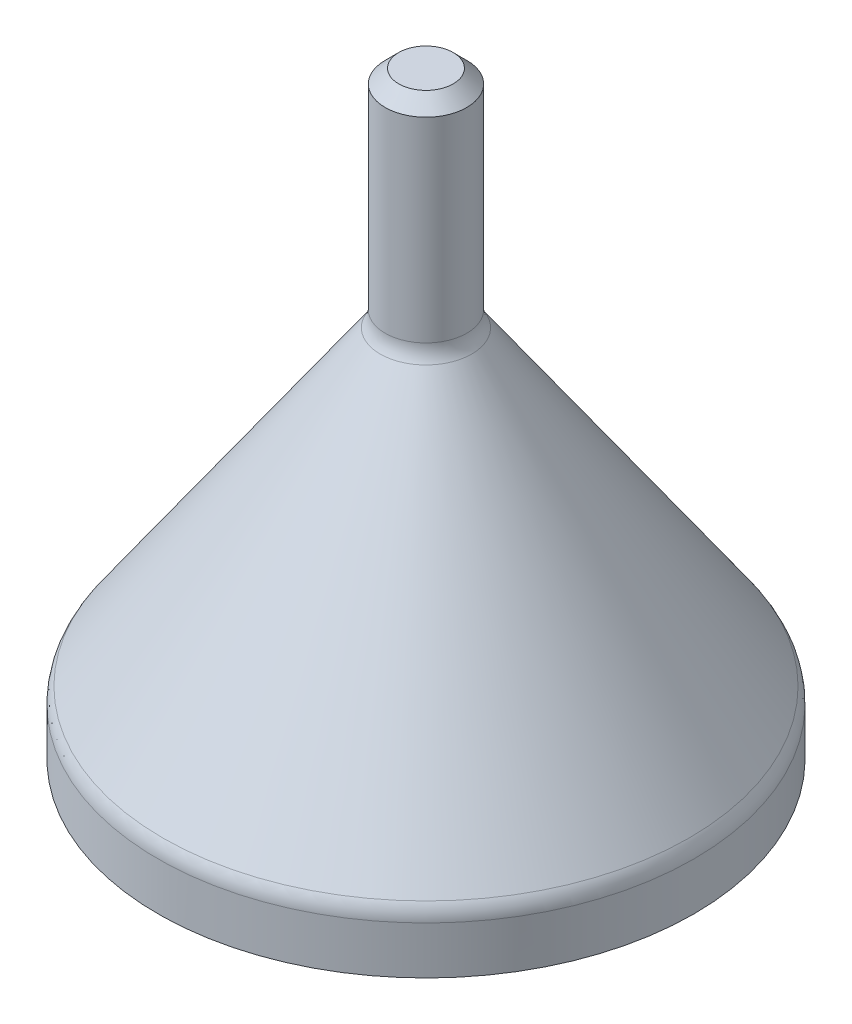
ISO-10303-21;
HEADER;
FILE_DESCRIPTION(('STEP AP214'),'2;1');
FILE_NAME('part.step','',(''),(''),'','','');
FILE_SCHEMA(('AUTOMOTIVE_DESIGN { 1 0 10303 214 1 1 1 1 }'));
ENDSEC;
DATA;
#1=APPLICATION_CONTEXT('core data for automotive mechanical design processes');
#2=APPLICATION_PROTOCOL_DEFINITION('international standard','automotive_design',2000,#1);
#3=PRODUCT_CONTEXT('',#1,'mechanical');
#4=PRODUCT('Part','Part','',(#3));
#5=PRODUCT_RELATED_PRODUCT_CATEGORY('part','',(#4));
#6=PRODUCT_DEFINITION_FORMATION('','',#4);
#7=PRODUCT_DEFINITION_CONTEXT('part definition',#1,'design');
#8=PRODUCT_DEFINITION('design','',#6,#7);
#9=PRODUCT_DEFINITION_SHAPE('','',#8);
#10=(LENGTH_UNIT() NAMED_UNIT(*) SI_UNIT(.MILLI.,.METRE.));
#11=(NAMED_UNIT(*) PLANE_ANGLE_UNIT() SI_UNIT($,.RADIAN.));
#12=(NAMED_UNIT(*) SI_UNIT($,.STERADIAN.) SOLID_ANGLE_UNIT());
#13=UNCERTAINTY_MEASURE_WITH_UNIT(LENGTH_MEASURE(1.E-05),#10,'distance_accuracy_value','');
#14=(GEOMETRIC_REPRESENTATION_CONTEXT(3) GLOBAL_UNCERTAINTY_ASSIGNED_CONTEXT((#13)) GLOBAL_UNIT_ASSIGNED_CONTEXT((#10,
#11,#12)) REPRESENTATION_CONTEXT('',''));
#15=CARTESIAN_POINT('',(0.,0.,0.));
#16=DIRECTION('',(0.,0.,1.));
#17=DIRECTION('',(1.,0.,0.));
#18=AXIS2_PLACEMENT_3D('',#15,#16,#17);
#19=CARTESIAN_POINT('',(0.,28.7782197193354,0.));
#20=DIRECTION('',(0.,-1.,0.));
#21=DIRECTION('',(1.,0.,0.));
#22=AXIS2_PLACEMENT_3D('',#19,#20,#21);
#23=CONICAL_SURFACE('',#22,0.,0.610865238198017);
#24=CARTESIAN_POINT('',(-12.5926114049583,10.7545224441937,-0.835936593249498));
#25=CARTESIAN_POINT('',(-12.5508956026552,10.8066246913389,-0.913561611274844));
#26=CARTESIAN_POINT('',(-12.5045538881382,10.8648521183377,-0.984613476689198));
#27=CARTESIAN_POINT('',(-12.4055523615441,10.9903638008953,-1.11298070252791));
#28=CARTESIAN_POINT('',(-12.3528814076504,11.0576640541483,-1.17027129037267));
#29=CARTESIAN_POINT('',(-12.2439356623663,11.1983240391587,-1.27071682922573));
#30=CARTESIAN_POINT('',(-12.1876919591053,11.2716327760279,-1.31397787493768));
#31=CARTESIAN_POINT('',(-12.0729697594106,11.4229124379558,-1.38709372737568));
#32=CARTESIAN_POINT('',(-12.0144920372611,11.50088175291,-1.41695313402002));
#33=CARTESIAN_POINT('',(-11.8859396960309,11.6745187058214,-1.4675331635222));
#34=CARTESIAN_POINT('',(-11.8156856151646,11.7708312197498,-1.48561356293596));
#35=CARTESIAN_POINT('',(-11.6758802099545,11.9657998903546,-1.50280354998056));
#36=CARTESIAN_POINT('',(-11.606329808705,12.0644586687203,-1.50189081403729));
#37=CARTESIAN_POINT('',(-11.4662190906323,12.2669622325049,-1.47975125590041));
#38=CARTESIAN_POINT('',(-11.3958101406985,12.3707967621472,-1.45742056492131));
#39=CARTESIAN_POINT('',(-11.2605663137459,12.5744895083554,-1.38975944551809));
#40=CARTESIAN_POINT('',(-11.1957215590801,12.674354594899,-1.34447080327255));
#41=CARTESIAN_POINT('',(-11.0907764768846,12.8394220356224,-1.24577625024087));
#42=CARTESIAN_POINT('',(-11.0487269293238,12.9066945535875,-1.19787807614214));
#43=CARTESIAN_POINT('',(-10.9702019014994,13.0342081443155,-1.08967448742342));
#44=CARTESIAN_POINT('',(-10.9337235041223,13.0944528929628,-1.02937560502852));
#45=CARTESIAN_POINT('',(-10.8673152359263,13.2056033588021,-0.896693332639933));
#46=CARTESIAN_POINT('',(-10.8374319710269,13.2564422236452,-0.824229934277203));
#47=CARTESIAN_POINT('',(-10.7857094163157,13.3453784863523,-0.669265636689653));
#48=CARTESIAN_POINT('',(-10.7638647543895,13.3834843919481,-0.586771490137676));
#49=CARTESIAN_POINT('',(-10.7312733052492,13.4407219942267,-0.425147956738924));
#50=CARTESIAN_POINT('',(-10.7194945163416,13.4616067390038,-0.346845248863057));
#51=CARTESIAN_POINT('',(-10.703248046651,13.4904814795136,-0.187172694659556));
#52=CARTESIAN_POINT('',(-10.6987760177962,13.4984791439893,-0.105804701923974));
#53=CARTESIAN_POINT('',(-10.6973554283625,13.5010168703904,0.0504147217069086));
#54=CARTESIAN_POINT('',(-10.6998130286008,13.4966191736057,0.125246277786922));
#55=CARTESIAN_POINT('',(-10.7109206781358,13.4768356792963,0.272957487391654));
#56=CARTESIAN_POINT('',(-10.7195697514825,13.4614516135325,0.345837446664768));
#57=CARTESIAN_POINT('',(-10.7427071992224,13.4206070141369,0.487072132558397));
#58=CARTESIAN_POINT('',(-10.7571483680597,13.3952279690842,0.555458361652506));
#59=CARTESIAN_POINT('',(-10.7914592821343,13.335520774105,0.686721698883544));
#60=CARTESIAN_POINT('',(-10.8113299486798,13.301191105431,0.749597869648752));
#61=CARTESIAN_POINT('',(-10.8572654768215,13.2227465461481,0.872054164587742));
#62=CARTESIAN_POINT('',(-10.8836212434015,13.1781818564972,0.931235705749465));
#63=CARTESIAN_POINT('',(-10.9411153531182,13.0822764064069,1.04115584944306));
#64=CARTESIAN_POINT('',(-10.9722554913462,13.0309331036604,1.09189126805001));
#65=CARTESIAN_POINT('',(-11.042364457927,12.9169670140834,1.18972007684476));
#66=CARTESIAN_POINT('',(-11.0818209744811,12.8537255746532,1.23574068779784));
#67=CARTESIAN_POINT('',(-11.1647594071077,12.7228917581338,1.3165676391019));
#68=CARTESIAN_POINT('',(-11.2082434704821,12.6552970660105,1.35136795248789));
#69=CARTESIAN_POINT('',(-11.3052506805847,12.5068223889713,1.41442505903487));
#70=CARTESIAN_POINT('',(-11.3592883076128,12.4255001520707,1.44084743495057));
#71=CARTESIAN_POINT('',(-11.4701714391519,12.2614259984783,1.47944920641372));
#72=CARTESIAN_POINT('',(-11.5270183816219,12.1786733640216,1.49162122749266));
#73=CARTESIAN_POINT('',(-11.6513410848862,12.0004955280357,1.50305160357387));
#74=CARTESIAN_POINT('',(-11.7190905285343,11.9051090967645,1.49999689327258));
#75=CARTESIAN_POINT('',(-11.8550215685947,11.7167847191676,1.47608034621491));
#76=CARTESIAN_POINT('',(-11.9232035702637,11.6238496943201,1.45519817163664));
#77=CARTESIAN_POINT('',(-12.0639863940158,11.434643526264,1.39324623362651));
#78=CARTESIAN_POINT('',(-12.1364527131596,11.3387905113602,1.35057184932841));
#79=CARTESIAN_POINT('',(-12.2767146378794,11.1556408810547,1.24428137219593));
#80=CARTESIAN_POINT('',(-12.3445169044964,11.0683319845564,1.18069592759113));
#81=CARTESIAN_POINT('',(-12.4526872386755,10.9304627153877,1.05453181211758));
#82=CARTESIAN_POINT('',(-12.4952144327866,10.8766989515809,0.997285964523039));
#83=CARTESIAN_POINT('',(-12.5743136266482,10.7772955533815,0.872542443731813));
#84=CARTESIAN_POINT('',(-12.6108947168745,10.7316435075502,0.805060730520137));
#85=CARTESIAN_POINT('',(-12.6703254184212,10.6578066574453,0.673194051513325));
#86=CARTESIAN_POINT('',(-12.6944570973184,10.6279642092017,0.610319914686144));
#87=CARTESIAN_POINT('',(-12.7359266290139,10.5768154453456,0.479057536097707));
#88=CARTESIAN_POINT('',(-12.7532678709476,10.5555048713195,0.410672065670199));
#89=CARTESIAN_POINT('',(-12.7800457291806,10.5226435665399,0.269609921976896));
#90=CARTESIAN_POINT('',(-12.7894339622827,10.5111525708588,0.196909821829435));
#91=CARTESIAN_POINT('',(-12.7993414619633,10.4990268034942,0.0500165519241918));
#92=CARTESIAN_POINT('',(-12.7998648062791,10.4983870403801,-0.0241759156383689));
#93=CARTESIAN_POINT('',(-12.7924213313269,10.5074960134544,-0.163757844371654));
#94=CARTESIAN_POINT('',(-12.785321863471,10.5161834587704,-0.22926812872854));
#95=CARTESIAN_POINT('',(-12.7644569816947,10.5417675667315,-0.357543452661431));
#96=CARTESIAN_POINT('',(-12.7506910752541,10.5586648359231,-0.420308289028612));
#97=CARTESIAN_POINT('',(-12.7162779823394,10.6010314129583,-0.545450632226986));
#98=CARTESIAN_POINT('',(-12.6952600784131,10.6269634718351,-0.607567574236428));
#99=CARTESIAN_POINT('',(-12.6477632584975,10.6858029433922,-0.726139919725178));
#100=CARTESIAN_POINT('',(-12.621279702296,10.7187162836825,-0.782590451626292));
#101=CARTESIAN_POINT('',(-12.5926114049583,10.7545224441937,-0.835936593249498));
#102=B_SPLINE_CURVE_WITH_KNOTS('',3,(#24,#25,#26,#27,#28,#29,#30,#31,#32,#33,#34,#35,#36,#37,
#38,#39,#40,#41,#42,#43,#44,#45,#46,#47,#48,#49,#50,#51,#52,#53,#54,#55,#56,#57,#58,#59,#60,#61,
#62,#63,#64,#65,#66,#67,#68,#69,#70,#71,#72,#73,#74,#75,#76,#77,#78,#79,#80,#81,#82,#83,#84,#85,
#86,#87,#88,#89,#90,#91,#92,#93,#94,#95,#96,#97,#98,#99,#100,#101),.UNSPECIFIED.,.T.,.F.,(4,2,2,
2,2,2,2,2,2,2,2,2,2,2,2,2,2,2,2,2,2,2,2,2,2,2,2,2,2,2,2,2,2,2,2,2,2,2,4),(0.,0.306813519229993,
0.614175282427592,0.91915535078691,1.22403065895648,1.58420875469197,1.94481020949508,
2.32505484887022,2.70460986988088,2.98151580564581,3.25827624972269,3.53693394996558,
3.81540508652097,4.05974806982483,4.3039455976484,4.52786755983203,4.75175423340075,
4.97385215047346,5.19598777781616,5.43092100289255,5.66594259090585,5.92772928679322,
6.1896563676209,6.4919413204163,6.79438263471473,7.1440466882637,7.49411017734753,
7.87476370165074,8.25486179036361,8.52183292863851,8.78839199926221,9.00848376263892,
9.22846553685432,9.44977618051768,9.67098502130495,9.8694511333961,10.0679319105099,
10.2786033755714,10.4894544370605),.UNSPECIFIED.);
#103=CARTESIAN_POINT('',(-12.5926114049583,10.7545224441937,-0.835936593249498));
#104=VERTEX_POINT('',#103);
#105=EDGE_CURVE('E190',#104,#104,#102,.T.);
#106=ORIENTED_EDGE('',*,*,#105,.F.);
#107=EDGE_LOOP('',(#106));
#108=FACE_BOUND('',#107,.T.);
#109=CARTESIAN_POINT('',(11.7132659625169,11.9137831722595,-1.49752016968533));
#110=CARTESIAN_POINT('',(11.7870811637891,11.8102962773236,-1.49156241075206));
#111=CARTESIAN_POINT('',(11.8615439415129,11.7078005300675,-1.47491254463486));
#112=CARTESIAN_POINT('',(12.0094563153704,11.5074312516468,-1.42062521342872));
#113=CARTESIAN_POINT('',(12.0829035863991,11.4095673783164,-1.38294582552693));
#114=CARTESIAN_POINT('',(12.2254170982042,11.2222294131524,-1.28688945090419));
#115=CARTESIAN_POINT('',(12.294510691411,11.1327007928822,-1.22866099603874));
#116=CARTESIAN_POINT('',(12.4252382284491,10.965155041504,-1.09122002317221));
#117=CARTESIAN_POINT('',(12.4868960288124,10.8871009097382,-1.01207736264008));
#118=CARTESIAN_POINT('',(12.5774310921033,10.7734168107309,-0.866372856612213));
#119=CARTESIAN_POINT('',(12.6099985097464,10.7327727572208,-0.805982470788031));
#120=CARTESIAN_POINT('',(12.6687786752162,10.6597145584473,-0.677553042576472));
#121=CARTESIAN_POINT('',(12.6949958294602,10.627294705707,-0.609519352103331));
#122=CARTESIAN_POINT('',(12.7396195607387,10.5722661559582,-0.466371437905145));
#123=CARTESIAN_POINT('',(12.7579551750226,10.5497465579881,-0.391200032240727));
#124=CARTESIAN_POINT('',(12.7849152588813,10.5166768360648,-0.236596386339301));
#125=CARTESIAN_POINT('',(12.7935498689991,10.5061142132951,-0.157168686436146));
#126=CARTESIAN_POINT('',(12.7998261157345,10.4984352613772,-0.00834814988183296));
#127=CARTESIAN_POINT('',(12.7988269111336,10.4996564672231,0.0609077582648478));
#128=CARTESIAN_POINT('',(12.7891172059464,10.5115403380602,0.198042939894432));
#129=CARTESIAN_POINT('',(12.7804075026347,10.5222020268945,0.265922354966043));
#130=CARTESIAN_POINT('',(12.7564362979742,10.5516146433761,0.395484485610808));
#131=CARTESIAN_POINT('',(12.7414728283408,10.5699977733809,0.457308160016786));
#132=CARTESIAN_POINT('',(12.7059180858014,10.6138140718584,0.576657157758586));
#133=CARTESIAN_POINT('',(12.6853258011459,10.6392485077774,0.634181705980079));
#134=CARTESIAN_POINT('',(12.6368971501649,10.6992995694738,0.750275396565759));
#135=CARTESIAN_POINT('',(12.608508955691,10.7346239629456,0.808245311569967));
#136=CARTESIAN_POINT('',(12.5471833009159,10.8113375352528,0.917354597627972));
#137=CARTESIAN_POINT('',(12.514241861687,10.8527320204858,0.968487916674434));
#138=CARTESIAN_POINT('',(12.4285034609652,10.9611336208239,1.08620138487265));
#139=CARTESIAN_POINT('',(12.3736734806929,11.0310079135855,1.14868086305455));
#140=CARTESIAN_POINT('',(12.2592467028571,11.1784191067084,1.25836057082329));
#141=CARTESIAN_POINT('',(12.1996430661411,11.2559670398253,1.30553837135752));
#142=CARTESIAN_POINT('',(12.077063566428,11.4174314231766,1.3852104729235));
#143=CARTESIAN_POINT('',(12.0140561708662,11.5014123153773,1.41752462191964));
#144=CARTESIAN_POINT('',(11.8870646865899,11.6730620552952,1.466657660209));
#145=CARTESIAN_POINT('',(11.8230804470581,11.7607314762386,1.48347413167169));
#146=CARTESIAN_POINT('',(11.6861580058429,11.9512664575483,1.50269899508566));
#147=CARTESIAN_POINT('',(11.6133012655485,12.054455198188,1.50259669845844));
#148=CARTESIAN_POINT('',(11.4705472245248,12.2606382181704,1.48081010511892));
#149=CARTESIAN_POINT('',(11.4006484599019,12.3636325690219,1.45913661728708));
#150=CARTESIAN_POINT('',(11.2786222625164,12.5472035689045,1.39931787202593));
#151=CARTESIAN_POINT('',(11.2255945607116,12.6284119431864,1.36494689383895));
#152=CARTESIAN_POINT('',(11.1245403205457,12.7858646385214,1.28077073258223));
#153=CARTESIAN_POINT('',(11.0765118658787,12.8621108574311,1.23097149277991));
#154=CARTESIAN_POINT('',(10.9866709269226,13.0071409474346,1.11549355100603));
#155=CARTESIAN_POINT('',(10.9449124585044,13.0758587300182,1.04968838289859));
#156=CARTESIAN_POINT('',(10.8698208892291,13.2012979141711,0.903400883998193));
#157=CARTESIAN_POINT('',(10.8364792533581,13.2580314586408,0.822933564998782));
#158=CARTESIAN_POINT('',(10.7839704123611,13.3484166965518,0.662542373972642));
#159=CARTESIAN_POINT('',(10.7634382287072,13.3842381257493,0.584287082287457));
#160=CARTESIAN_POINT('',(10.7304224587858,13.4422116716986,0.421288166773555));
#161=CARTESIAN_POINT('',(10.7179313623975,13.464376542411,0.336550680128121));
#162=CARTESIAN_POINT('',(10.7025034663088,13.4918140507982,0.174379881602239));
#163=CARTESIAN_POINT('',(10.6985805149822,13.4988290142017,0.0973300471512026));
#164=CARTESIAN_POINT('',(10.6974207681067,13.5008994733137,-0.0569690945058429));
#165=CARTESIAN_POINT('',(10.7001815573893,13.4959592890131,-0.134218319585487));
#166=CARTESIAN_POINT('',(10.7120284854295,13.4748663661891,-0.283161436972278));
#167=CARTESIAN_POINT('',(10.7208313289082,13.4592158970343,-0.354950278233228));
#168=CARTESIAN_POINT('',(10.744202080129,13.4179776741545,-0.494612641163449));
#169=CARTESIAN_POINT('',(10.7587701757748,13.3923895965394,-0.562486035136184));
#170=CARTESIAN_POINT('',(10.7937387585931,13.331572253393,-0.694508696922351));
#171=CARTESIAN_POINT('',(10.8142879411962,13.2960983161571,-0.758505225636307));
#172=CARTESIAN_POINT('',(10.860478563144,13.2173080445247,-0.87941677162039));
#173=CARTESIAN_POINT('',(10.8861213652969,13.1739896115923,-0.93632988706614));
#174=CARTESIAN_POINT('',(10.9443207559582,13.0769545647246,-1.04692217229046));
#175=CARTESIAN_POINT('',(10.9772874117477,13.0226581009078,-1.0998747376024));
#176=CARTESIAN_POINT('',(11.0476428896149,12.9085031337516,-1.19590754623009));
#177=CARTESIAN_POINT('',(11.0850341670447,12.848641546149,-1.23898226872354));
#178=CARTESIAN_POINT('',(11.168809417327,12.7165207257995,-1.32038622916697));
#179=CARTESIAN_POINT('',(11.2157223437028,12.6436904945171,-1.35724078999774));
#180=CARTESIAN_POINT('',(11.3130208064513,12.4951307296155,-1.41820263799831));
#181=CARTESIAN_POINT('',(11.3634068521782,12.4194007714606,-1.44230805091241));
#182=CARTESIAN_POINT('',(11.4631231395631,12.2718602366534,-1.47697030163077));
#183=CARTESIAN_POINT('',(11.5122962498151,12.2001288600889,-1.48832973135795));
#184=CARTESIAN_POINT('',(11.6119657404553,12.0567028702671,-1.50065629469935));
#185=CARTESIAN_POINT('',(11.6624624758156,11.9850082722393,-1.50162061134937));
#186=CARTESIAN_POINT('',(11.7132659625169,11.9137831722595,-1.49752016968533));
#187=B_SPLINE_CURVE_WITH_KNOTS('',3,(#109,#110,#111,#112,#113,#114,#115,#116,#117,#118,#119,
#120,#121,#122,#123,#124,#125,#126,#127,#128,#129,#130,#131,#132,#133,#134,#135,#136,#137,#138,
#139,#140,#141,#142,#143,#144,#145,#146,#147,#148,#149,#150,#151,#152,#153,#154,#155,#156,#157,
#158,#159,#160,#161,#162,#163,#164,#165,#166,#167,#168,#169,#170,#171,#172,#173,#174,#175,#176,
#177,#178,#179,#180,#181,#182,#183,#184,#185,#186),.UNSPECIFIED.,.T.,.F.,(4,2,2,2,2,2,2,2,2,2,2,
2,2,2,2,2,2,2,2,2,2,2,2,2,2,2,2,2,2,2,2,2,2,2,2,2,2,2,4),(0.,0.381450889691871,
0.763664940332903,1.14317104102086,1.52142519866165,1.75979335681162,1.99799563553228,
2.23829983625996,2.47835261055227,2.68509489462516,2.89181580380151,3.08964204664326,
3.28750387110516,3.50743635514111,3.72756226037539,4.05158685133837,4.37608427025312,
4.70441728455703,5.03280151422888,5.40995499487538,5.786919586763,6.09437324043503,
6.40170860391781,6.71155601879107,7.02108796200031,7.28498968490526,7.54864457298773,
7.77987190585097,8.01101569722884,8.23200200623793,8.45299551831966,8.68003657299444,
8.90713845497992,9.15424726695354,9.40149385564534,9.68285282161324,9.96425313875016,
10.2267164919841,10.4892509681855),.UNSPECIFIED.);
#188=CARTESIAN_POINT('',(11.7132659625169,11.9137831722595,-1.49752016968533));
#189=VERTEX_POINT('',#188);
#190=EDGE_CURVE('E183',#189,#189,#187,.T.);
#191=ORIENTED_EDGE('',*,*,#190,.F.);
#192=EDGE_LOOP('',(#191));
#193=FACE_BOUND('',#192,.T.);
#194=CARTESIAN_POINT('',(0.,3.5,0.));
#195=DIRECTION('',(0.,-1.,0.));
#196=DIRECTION('',(1.,0.,0.));
#197=AXIS2_PLACEMENT_3D('',#194,#195,#196);
#198=CIRCLE('',#197,17.7);
#199=CARTESIAN_POINT('',(17.7,3.5,0.));
#200=VERTEX_POINT('',#199);
#201=EDGE_CURVE('E168',#200,#200,#198,.T.);
#202=ORIENTED_EDGE('',*,*,#201,.T.);
#203=EDGE_LOOP('',(#202));
#204=FACE_BOUND('',#203,.T.);
#205=CARTESIAN_POINT('',(0.,28.7782197193354,0.));
#206=VERTEX_POINT('',#205);
#207=VERTEX_LOOP('',#206);
#208=FACE_BOUND('',#207,.T.);
#209=ADVANCED_FACE('F33',(#108,#193,#204,#208),#23,.F.);
#210=CARTESIAN_POINT('',(0.,0.,0.));
#211=DIRECTION('',(0.,-1.,0.));
#212=DIRECTION('',(1.,0.,0.));
#213=AXIS2_PLACEMENT_3D('',#210,#211,#212);
#214=CYLINDRICAL_SURFACE('',#213,17.7);
#215=DIRECTION('',(0.,-1.,0.));
#216=VECTOR('',#215,1.);
#217=CARTESIAN_POINT('',(3.2,3.,17.4083313387585));
#218=LINE('',#217,#216);
#219=CARTESIAN_POINT('',(3.2,3.,17.4083313387585));
#220=VERTEX_POINT('',#219);
#221=CARTESIAN_POINT('',(3.2,0.,17.4083313387585));
#222=VERTEX_POINT('',#221);
#223=EDGE_CURVE('E134',#220,#222,#218,.T.);
#224=ORIENTED_EDGE('',*,*,#223,.F.);
#225=CARTESIAN_POINT('',(0.,3.,0.));
#226=DIRECTION('',(0.,1.,0.));
#227=DIRECTION('',(1.,0.,0.));
#228=AXIS2_PLACEMENT_3D('',#225,#226,#227);
#229=CIRCLE('',#228,17.7);
#230=CARTESIAN_POINT('',(-3.2,3.,17.4083313387585));
#231=VERTEX_POINT('',#230);
#232=EDGE_CURVE('E116',#231,#220,#229,.T.);
#233=ORIENTED_EDGE('',*,*,#232,.F.);
#234=DIRECTION('',(0.,-1.,0.));
#235=VECTOR('',#234,1.);
#236=CARTESIAN_POINT('',(-3.2,3.,17.4083313387585));
#237=LINE('',#236,#235);
#238=CARTESIAN_POINT('',(-3.2,0.,17.4083313387585));
#239=VERTEX_POINT('',#238);
#240=EDGE_CURVE('E107',#231,#239,#237,.T.);
#241=ORIENTED_EDGE('',*,*,#240,.T.);
#242=CARTESIAN_POINT('',(0.,0.,0.));
#243=DIRECTION('',(0.,-1.,0.));
#244=DIRECTION('',(1.,0.,0.));
#245=AXIS2_PLACEMENT_3D('',#242,#243,#244);
#246=CIRCLE('',#245,17.7);
#247=CARTESIAN_POINT('',(-3.2,0.,-17.4083313387585));
#248=VERTEX_POINT('',#247);
#249=EDGE_CURVE('E167',#239,#248,#246,.T.);
#250=ORIENTED_EDGE('',*,*,#249,.T.);
#251=DIRECTION('',(0.,-1.,0.));
#252=VECTOR('',#251,1.);
#253=CARTESIAN_POINT('',(-3.2,3.,-17.4083313387585));
#254=LINE('',#253,#252);
#255=CARTESIAN_POINT('',(-3.2,3.,-17.4083313387585));
#256=VERTEX_POINT('',#255);
#257=EDGE_CURVE('E156',#256,#248,#254,.T.);
#258=ORIENTED_EDGE('',*,*,#257,.F.);
#259=CARTESIAN_POINT('',(0.,3.,0.));
#260=DIRECTION('',(0.,1.,0.));
#261=DIRECTION('',(1.,0.,0.));
#262=AXIS2_PLACEMENT_3D('',#259,#260,#261);
#263=CIRCLE('',#262,17.7);
#264=CARTESIAN_POINT('',(3.19999999999999,3.,-17.4083313387585));
#265=VERTEX_POINT('',#264);
#266=EDGE_CURVE('E144',#265,#256,#263,.T.);
#267=ORIENTED_EDGE('',*,*,#266,.F.);
#268=DIRECTION('',(0.,-1.,0.));
#269=VECTOR('',#268,1.);
#270=CARTESIAN_POINT('',(3.19999999999999,3.,-17.4083313387585));
#271=LINE('',#270,#269);
#272=CARTESIAN_POINT('',(3.19999999999999,0.,-17.4083313387585));
#273=VERTEX_POINT('',#272);
#274=EDGE_CURVE('E158',#265,#273,#271,.T.);
#275=ORIENTED_EDGE('',*,*,#274,.T.);
#276=EDGE_CURVE('E164',#273,#222,#246,.T.);
#277=ORIENTED_EDGE('',*,*,#276,.T.);
#278=EDGE_LOOP('',(#224,#233,#241,#250,#258,#267,#275,#277));
#279=FACE_BOUND('',#278,.T.);
#280=ORIENTED_EDGE('',*,*,#201,.F.);
#281=EDGE_LOOP('',(#280));
#282=FACE_BOUND('',#281,.T.);
#283=ADVANCED_FACE('F225',(#279,#282),#214,.F.);
#284=CARTESIAN_POINT('',(17.7,0.,0.));
#285=DIRECTION('',(0.,-1.,0.));
#286=DIRECTION('',(1.,0.,0.));
#287=AXIS2_PLACEMENT_3D('',#284,#285,#286);
#288=PLANE('',#287);
#289=DIRECTION('',(0.,0.,1.));
#290=VECTOR('',#289,1.);
#291=CARTESIAN_POINT('',(3.2,0.,18.6271307506014));
#292=LINE('',#291,#290);
#293=CARTESIAN_POINT('',(3.2,0.,18.6271307506014));
#294=VERTEX_POINT('',#293);
#295=EDGE_CURVE('E120',#222,#294,#292,.T.);
#296=ORIENTED_EDGE('',*,*,#295,.F.);
#297=ORIENTED_EDGE('',*,*,#276,.F.);
#298=DIRECTION('',(0.,0.,1.));
#299=VECTOR('',#298,1.);
#300=CARTESIAN_POINT('',(3.2,0.,-17.4083313387585));
#301=LINE('',#300,#299);
#302=CARTESIAN_POINT('',(3.2,0.,-18.6271307506014));
#303=VERTEX_POINT('',#302);
#304=EDGE_CURVE('E151',#303,#273,#301,.T.);
#305=ORIENTED_EDGE('',*,*,#304,.F.);
#306=CARTESIAN_POINT('',(0.,0.,0.));
#307=DIRECTION('',(0.,-1.,0.));
#308=DIRECTION('',(1.,0.,0.));
#309=AXIS2_PLACEMENT_3D('',#306,#307,#308);
#310=CIRCLE('',#309,18.9);
#311=CARTESIAN_POINT('',(-3.2,0.,-18.6271307506014));
#312=VERTEX_POINT('',#311);
#313=EDGE_CURVE('E56',#312,#303,#310,.T.);
#314=ORIENTED_EDGE('',*,*,#313,.F.);
#315=DIRECTION('',(0.,0.,-1.));
#316=VECTOR('',#315,1.);
#317=CARTESIAN_POINT('',(-3.2,0.,-17.4083313387585));
#318=LINE('',#317,#316);
#319=EDGE_CURVE('E141',#248,#312,#318,.T.);
#320=ORIENTED_EDGE('',*,*,#319,.F.);
#321=ORIENTED_EDGE('',*,*,#249,.F.);
#322=DIRECTION('',(0.,0.,-1.));
#323=VECTOR('',#322,1.);
#324=CARTESIAN_POINT('',(-3.2,0.,18.6271307506014));
#325=LINE('',#324,#323);
#326=CARTESIAN_POINT('',(-3.2,0.,18.6271307506014));
#327=VERTEX_POINT('',#326);
#328=EDGE_CURVE('E123',#327,#239,#325,.T.);
#329=ORIENTED_EDGE('',*,*,#328,.F.);
#330=CARTESIAN_POINT('',(0.,0.,0.));
#331=DIRECTION('',(0.,-1.,0.));
#332=DIRECTION('',(1.,0.,0.));
#333=AXIS2_PLACEMENT_3D('',#330,#331,#332);
#334=CIRCLE('',#333,18.9);
#335=EDGE_CURVE('E48',#294,#327,#334,.T.);
#336=ORIENTED_EDGE('',*,*,#335,.F.);
#337=EDGE_LOOP('',(#296,#297,#305,#314,#320,#321,#329,#336));
#338=FACE_BOUND('',#337,.T.);
#339=CARTESIAN_POINT('',(0.,0.,0.));
#340=DIRECTION('',(0.,-1.,0.));
#341=DIRECTION('',(1.,0.,0.));
#342=AXIS2_PLACEMENT_3D('',#339,#340,#341);
#343=CIRCLE('',#342,19.7);
#344=CARTESIAN_POINT('',(19.7,0.,0.));
#345=VERTEX_POINT('',#344);
#346=EDGE_CURVE('E133',#345,#345,#343,.T.);
#347=ORIENTED_EDGE('',*,*,#346,.T.);
#348=EDGE_LOOP('',(#347));
#349=FACE_BOUND('',#348,.T.);
#350=ADVANCED_FACE('F222',(#338,#349),#288,.T.);
#351=CARTESIAN_POINT('',(0.,0.,0.));
#352=DIRECTION('',(0.,-1.,0.));
#353=DIRECTION('',(1.,0.,0.));
#354=AXIS2_PLACEMENT_3D('',#351,#352,#353);
#355=CYLINDRICAL_SURFACE('',#354,19.7);
#356=CARTESIAN_POINT('',(0.,3.5,0.));
#357=DIRECTION('',(0.,1.,0.));
#358=DIRECTION('',(-1.,0.,0.));
#359=AXIS2_PLACEMENT_3D('',#356,#357,#358);
#360=CIRCLE('',#359,19.7);
#361=CARTESIAN_POINT('',(-19.7,3.5,0.));
#362=VERTEX_POINT('',#361);
#363=EDGE_CURVE('E180',#362,#362,#360,.F.);
#364=ORIENTED_EDGE('',*,*,#363,.T.);
#365=EDGE_LOOP('',(#364));
#366=FACE_BOUND('',#365,.T.);
#367=ORIENTED_EDGE('',*,*,#346,.F.);
#368=EDGE_LOOP('',(#367));
#369=FACE_BOUND('',#368,.T.);
#370=ADVANCED_FACE('F218',(#366,#369),#355,.T.);
#371=CARTESIAN_POINT('',(0.,4.13059757775796,0.));
#372=DIRECTION('',(0.,-1.,0.));
#373=DIRECTION('',(1.,0.,0.));
#374=AXIS2_PLACEMENT_3D('',#371,#372,#373);
#375=CONICAL_SURFACE('',#374,19.7,0.610865238198017);
#376=CARTESIAN_POINT('',(0.,27.4641139954071,0.));
#377=DIRECTION('',(0.,-1.,0.));
#378=DIRECTION('',(1.,0.,0.));
#379=AXIS2_PLACEMENT_3D('',#376,#377,#378);
#380=CIRCLE('',#379,3.36169591142201);
#381=CARTESIAN_POINT('',(3.36169591142201,27.4641139954071,0.));
#382=VERTEX_POINT('',#381);
#383=EDGE_CURVE('E174',#382,#382,#380,.T.);
#384=CARTESIAN_POINT('',(0.,4.6471528727021,0.));
#385=DIRECTION('',(0.,1.,0.));
#386=DIRECTION('',(-1.,0.,0.));
#387=AXIS2_PLACEMENT_3D('',#384,#385,#386);
#388=CIRCLE('',#387,19.338304088578);
#389=CARTESIAN_POINT('',(19.338304088578,4.64715287270209,0.));
#390=VERTEX_POINT('',#389);
#391=EDGE_CURVE('E171',#390,#390,#388,.T.);
#392=CARTESIAN_POINT('',(3.36169591142201,27.4641139954071,0.));
#393=CARTESIAN_POINT('',(3.52811891326738,27.2264373170456,0.));
#394=CARTESIAN_POINT('',(3.69454191511276,26.9887606386841,0.));
#395=CARTESIAN_POINT('',(4.02738791880351,26.5134072819611,0.));
#396=CARTESIAN_POINT('',(4.19381092064888,26.2757306035995,0.));
#397=CARTESIAN_POINT('',(4.52665692433963,25.8003772468765,0.));
#398=CARTESIAN_POINT('',(4.69307992618501,25.562700568515,0.));
#399=CARTESIAN_POINT('',(5.02592592987576,25.087347211792,0.));
#400=CARTESIAN_POINT('',(5.19234893172113,24.8496705334305,0.));
#401=CARTESIAN_POINT('',(5.52519493541188,24.3743171767075,0.));
#402=CARTESIAN_POINT('',(5.69161793725726,24.136640498346,0.));
#403=CARTESIAN_POINT('',(6.02446394094801,23.6612871416229,0.));
#404=CARTESIAN_POINT('',(6.19088694279338,23.4236104632614,0.));
#405=CARTESIAN_POINT('',(6.52373294648413,22.9482571065384,0.));
#406=CARTESIAN_POINT('',(6.6901559483295,22.7105804281769,0.));
#407=CARTESIAN_POINT('',(7.02300195202025,22.2352270714539,0.));
#408=CARTESIAN_POINT('',(7.18942495386563,21.9975503930924,0.));
#409=CARTESIAN_POINT('',(7.52227095755638,21.5221970363693,0.));
#410=CARTESIAN_POINT('',(7.68869395940175,21.2845203580078,0.));
#411=CARTESIAN_POINT('',(8.0215399630925,20.8091670012848,0.));
#412=CARTESIAN_POINT('',(8.18796296493788,20.5714903229233,0.));
#413=CARTESIAN_POINT('',(8.52080896862863,20.0961369662003,0.));
#414=CARTESIAN_POINT('',(8.687231970474,19.8584602878388,0.));
#415=CARTESIAN_POINT('',(9.02007797416475,19.3831069311157,0.));
#416=CARTESIAN_POINT('',(9.18650097601012,19.1454302527542,0.));
#417=CARTESIAN_POINT('',(9.51934697970088,18.6700768960312,0.));
#418=CARTESIAN_POINT('',(9.68576998154625,18.4324002176697,0.));
#419=CARTESIAN_POINT('',(10.018615985237,17.9570468609467,0.));
#420=CARTESIAN_POINT('',(10.1850389870824,17.7193701825852,0.));
#421=CARTESIAN_POINT('',(10.5178849907731,17.2440168258621,0.));
#422=CARTESIAN_POINT('',(10.6843079926185,17.0063401475006,0.));
#423=CARTESIAN_POINT('',(11.0171539963092,16.5309867907776,0.));
#424=CARTESIAN_POINT('',(11.1835769981546,16.2933101124161,0.));
#425=CARTESIAN_POINT('',(11.5164230018454,15.8179567556931,0.));
#426=CARTESIAN_POINT('',(11.6828460036907,15.5802800773316,0.));
#427=CARTESIAN_POINT('',(12.0156920073815,15.1049267206086,0.));
#428=CARTESIAN_POINT('',(12.1821150092269,14.867250042247,0.));
#429=CARTESIAN_POINT('',(12.5149610129176,14.391896685524,0.));
#430=CARTESIAN_POINT('',(12.681384014763,14.1542200071625,0.));
#431=CARTESIAN_POINT('',(13.0142300184537,13.6788666504395,0.));
#432=CARTESIAN_POINT('',(13.1806530202991,13.441189972078,0.));
#433=CARTESIAN_POINT('',(13.5134990239899,12.965836615355,0.));
#434=CARTESIAN_POINT('',(13.6799220258352,12.7281599369934,0.));
#435=CARTESIAN_POINT('',(14.012768029526,12.2528065802704,0.));
#436=CARTESIAN_POINT('',(14.1791910313714,12.0151299019089,0.));
#437=CARTESIAN_POINT('',(14.5120370350621,11.5397765451859,0.));
#438=CARTESIAN_POINT('',(14.6784600369075,11.3020998668244,0.));
#439=CARTESIAN_POINT('',(15.0113060405982,10.8267465101014,0.));
#440=CARTESIAN_POINT('',(15.1777290424436,10.5890698317399,0.));
#441=CARTESIAN_POINT('',(15.5105750461344,10.1137164750168,0.));
#442=CARTESIAN_POINT('',(15.6769980479797,9.87603979665532,0.));
#443=CARTESIAN_POINT('',(16.0098440516705,9.4006864399323,0.));
#444=CARTESIAN_POINT('',(16.1762670535159,9.16300976157079,0.));
#445=CARTESIAN_POINT('',(16.5091130572066,8.68765640484777,0.));
#446=CARTESIAN_POINT('',(16.675536059052,8.44997972648626,0.));
#447=CARTESIAN_POINT('',(17.0083820627427,7.97462636976324,0.));
#448=CARTESIAN_POINT('',(17.1748050645881,7.73694969140173,0.));
#449=CARTESIAN_POINT('',(17.5076510682789,7.26159633467871,0.));
#450=CARTESIAN_POINT('',(17.6740740701242,7.0239196563172,0.));
#451=CARTESIAN_POINT('',(18.006920073815,6.54856629959418,0.));
#452=CARTESIAN_POINT('',(18.1733430756604,6.31088962123267,0.));
#453=CARTESIAN_POINT('',(18.5061890793511,5.83553626450965,0.));
#454=CARTESIAN_POINT('',(18.6726120811965,5.59785958614814,0.));
#455=CARTESIAN_POINT('',(19.0054580848872,5.12250622942511,0.));
#456=CARTESIAN_POINT('',(19.1718810867326,4.8848295510636,0.));
#457=CARTESIAN_POINT('',(19.338304088578,4.64715287270209,0.));
#458=B_SPLINE_CURVE_WITH_KNOTS('',3,(#392,#393,#394,#395,#396,#397,#398,#399,#400,#401,#402,
#403,#404,#405,#406,#407,#408,#409,#410,#411,#412,#413,#414,#415,#416,#417,#418,#419,#420,#421,
#422,#423,#424,#425,#426,#427,#428,#429,#430,#431,#432,#433,#434,#435,#436,#437,#438,#439,#440,
#441,#442,#443,#444,#445,#446,#447,#448,#449,#450,#451,#452,#453,#454,#455,#456,#457),
.UNSPECIFIED.,.F.,.F.,(4,2,2,2,2,2,2,2,2,2,2,2,2,2,2,2,2,2,2,2,2,2,2,2,2,2,2,2,2,2,2,2,4),(0.,
0.87044894785489,1.74089789570977,2.61134684356466,3.48179579141955,4.35224473927443,
5.22269368712932,6.09314263498421,6.96359158283909,7.83404053069398,8.70448947854886,
9.57493842640375,10.4453873742586,11.3158363221135,12.1862852699684,13.0567342178233,
13.9271831656782,14.7976321135331,15.668081061388,16.5385300092428,17.4089789570977,
18.2794279049526,19.1498768528075,20.0203258006624,20.8907747485173,21.7612236963722,
22.631672644227,23.5021215920819,24.3725705399368,25.2430194877917,26.1134684356466,
26.9839173835015,27.8543663313564),.UNSPECIFIED.);
#459=EDGE_CURVE('BSEAM214',#382,#390,#458,.T.);
#460=ORIENTED_EDGE('',*,*,#383,.T.);
#461=ORIENTED_EDGE('',*,*,#391,.T.);
#462=ORIENTED_EDGE('',*,*,#459,.T.);
#463=ORIENTED_EDGE('',*,*,#459,.F.);
#464=EDGE_LOOP('',(#460,#462,#461,#463));
#465=FACE_BOUND('',#464,.T.);
#466=ADVANCED_FACE('F214',(#465),#375,.T.);
#467=CARTESIAN_POINT('',(0.,0.,0.));
#468=DIRECTION('',(0.,-1.,0.));
#469=DIRECTION('',(1.,0.,0.));
#470=AXIS2_PLACEMENT_3D('',#467,#468,#469);
#471=CYLINDRICAL_SURFACE('',#470,2.99999999999999);
#472=CARTESIAN_POINT('',(0.,42.9806692903512,0.));
#473=DIRECTION('',(0.,1.,0.));
#474=DIRECTION('',(-1.,0.,0.));
#475=AXIS2_PLACEMENT_3D('',#472,#473,#474);
#476=CIRCLE('',#475,2.99999999999999);
#477=CARTESIAN_POINT('',(-2.99999999999999,42.9806692903512,0.));
#478=VERTEX_POINT('',#477);
#479=EDGE_CURVE('E41',#478,#478,#476,.F.);
#480=ORIENTED_EDGE('',*,*,#479,.T.);
#481=EDGE_LOOP('',(#480));
#482=FACE_BOUND('',#481,.T.);
#483=CARTESIAN_POINT('',(0.,28.6112668681092,0.));
#484=DIRECTION('',(0.,-1.,0.));
#485=DIRECTION('',(1.,0.,0.));
#486=AXIS2_PLACEMENT_3D('',#483,#484,#485);
#487=CIRCLE('',#486,2.99999999999999);
#488=CARTESIAN_POINT('',(3.,28.6112668681092,0.));
#489=VERTEX_POINT('',#488);
#490=EDGE_CURVE('E177',#489,#489,#487,.F.);
#491=ORIENTED_EDGE('',*,*,#490,.T.);
#492=EDGE_LOOP('',(#491));
#493=FACE_BOUND('',#492,.T.);
#494=ADVANCED_FACE('F210',(#482,#493),#471,.T.);
#495=CARTESIAN_POINT('',(3.,43.9806692903512,0.));
#496=DIRECTION('',(0.,1.,0.));
#497=DIRECTION('',(-1.,0.,0.));
#498=AXIS2_PLACEMENT_3D('',#495,#496,#497);
#499=PLANE('',#498);
#500=CARTESIAN_POINT('',(0.,43.9806692903512,0.));
#501=DIRECTION('',(0.,1.,0.));
#502=DIRECTION('',(-1.,0.,0.));
#503=AXIS2_PLACEMENT_3D('',#500,#501,#502);
#504=CIRCLE('',#503,1.99999999999997);
#505=CARTESIAN_POINT('',(-1.99999999999997,43.9806692903512,0.));
#506=VERTEX_POINT('',#505);
#507=EDGE_CURVE('E11',#506,#506,#504,.T.);
#508=ORIENTED_EDGE('',*,*,#507,.T.);
#509=EDGE_LOOP('',(#508));
#510=FACE_BOUND('',#509,.T.);
#511=ADVANCED_FACE('F205',(#510),#499,.T.);
#512=CARTESIAN_POINT('',(0.,28.6112668681092,0.));
#513=DIRECTION('',(0.,-1.,0.));
#514=DIRECTION('',(1.,0.,0.));
#515=AXIS2_PLACEMENT_3D('',#512,#513,#514);
#516=TOROIDAL_SURFACE('',#515,4.99999999999999,2.);
#517=ORIENTED_EDGE('',*,*,#490,.F.);
#518=EDGE_LOOP('',(#517));
#519=FACE_BOUND('',#518,.T.);
#520=ORIENTED_EDGE('',*,*,#383,.F.);
#521=EDGE_LOOP('',(#520));
#522=FACE_BOUND('',#521,.T.);
#523=ADVANCED_FACE('F209',(#519,#522),#516,.F.);
#524=CARTESIAN_POINT('',(0.,3.5,0.));
#525=DIRECTION('',(0.,1.,0.));
#526=DIRECTION('',(-1.,0.,0.));
#527=AXIS2_PLACEMENT_3D('',#524,#525,#526);
#528=TOROIDAL_SURFACE('',#527,17.7,2.);
#529=ORIENTED_EDGE('',*,*,#391,.F.);
#530=EDGE_LOOP('',(#529));
#531=FACE_BOUND('',#530,.T.);
#532=ORIENTED_EDGE('',*,*,#363,.F.);
#533=EDGE_LOOP('',(#532));
#534=FACE_BOUND('',#533,.T.);
#535=ADVANCED_FACE('F201',(#531,#534),#528,.T.);
#536=CARTESIAN_POINT('',(-500000.,12.,0.));
#537=DIRECTION('',(1.,0.,0.));
#538=DIRECTION('',(0.,0.,-1.));
#539=AXIS2_PLACEMENT_3D('',#536,#537,#538);
#540=CYLINDRICAL_SURFACE('',#539,1.5);
#541=ORIENTED_EDGE('',*,*,#105,.T.);
#542=EDGE_LOOP('',(#541));
#543=FACE_BOUND('',#542,.T.);
#544=ORIENTED_EDGE('',*,*,#190,.T.);
#545=EDGE_LOOP('',(#544));
#546=FACE_BOUND('',#545,.T.);
#547=ADVANCED_FACE('F196',(#543,#546),#540,.T.);
#548=CARTESIAN_POINT('',(0.,42.9806692903512,0.));
#549=DIRECTION('',(0.,-1.,0.));
#550=DIRECTION('',(1.,0.,0.));
#551=AXIS2_PLACEMENT_3D('',#548,#549,#550);
#552=CONICAL_SURFACE('',#551,2.99999999999999,0.785398163397454);
#553=ORIENTED_EDGE('',*,*,#507,.F.);
#554=EDGE_LOOP('',(#553));
#555=FACE_BOUND('',#554,.T.);
#556=ORIENTED_EDGE('',*,*,#479,.F.);
#557=EDGE_LOOP('',(#556));
#558=FACE_BOUND('',#557,.T.);
#559=ADVANCED_FACE('F35',(#555,#558),#552,.T.);
#560=CARTESIAN_POINT('',(0.,3.,0.));
#561=DIRECTION('',(0.,-1.,0.));
#562=DIRECTION('',(1.,0.,0.));
#563=AXIS2_PLACEMENT_3D('',#560,#561,#562);
#564=CYLINDRICAL_SURFACE('',#563,18.9);
#565=ORIENTED_EDGE('',*,*,#313,.T.);
#566=DIRECTION('',(0.,-1.,0.));
#567=VECTOR('',#566,1.);
#568=CARTESIAN_POINT('',(3.2,3.,-18.6271307506014));
#569=LINE('',#568,#567);
#570=CARTESIAN_POINT('',(3.2,3.,-18.6271307506014));
#571=VERTEX_POINT('',#570);
#572=EDGE_CURVE('E149',#571,#303,#569,.T.);
#573=ORIENTED_EDGE('',*,*,#572,.F.);
#574=CARTESIAN_POINT('',(0.,3.,0.));
#575=DIRECTION('',(0.,-1.,0.));
#576=DIRECTION('',(1.,0.,0.));
#577=AXIS2_PLACEMENT_3D('',#574,#575,#576);
#578=CIRCLE('',#577,18.9);
#579=CARTESIAN_POINT('',(-3.2,3.,-18.6271307506014));
#580=VERTEX_POINT('',#579);
#581=EDGE_CURVE('E137',#580,#571,#578,.T.);
#582=ORIENTED_EDGE('',*,*,#581,.F.);
#583=DIRECTION('',(0.,-1.,0.));
#584=VECTOR('',#583,1.);
#585=CARTESIAN_POINT('',(-3.2,3.,-18.6271307506014));
#586=LINE('',#585,#584);
#587=EDGE_CURVE('E129',#580,#312,#586,.T.);
#588=ORIENTED_EDGE('',*,*,#587,.T.);
#589=EDGE_LOOP('',(#565,#573,#582,#588));
#590=FACE_BOUND('',#589,.T.);
#591=ADVANCED_FACE('F203',(#590),#564,.F.);
#592=CARTESIAN_POINT('',(-3.2,3.,-17.4083313387585));
#593=DIRECTION('',(-1.,0.,0.));
#594=DIRECTION('',(0.,-1.,0.));
#595=AXIS2_PLACEMENT_3D('',#592,#593,#594);
#596=PLANE('',#595);
#597=ORIENTED_EDGE('',*,*,#319,.T.);
#598=ORIENTED_EDGE('',*,*,#587,.F.);
#599=DIRECTION('',(0.,0.,-1.));
#600=VECTOR('',#599,1.);
#601=CARTESIAN_POINT('',(-3.2,3.,-17.4083313387585));
#602=LINE('',#601,#600);
#603=EDGE_CURVE('E146',#256,#580,#602,.T.);
#604=ORIENTED_EDGE('',*,*,#603,.F.);
#605=ORIENTED_EDGE('',*,*,#257,.T.);
#606=EDGE_LOOP('',(#597,#598,#604,#605));
#607=FACE_BOUND('',#606,.T.);
#608=ADVANCED_FACE('F251',(#607),#596,.F.);
#609=CARTESIAN_POINT('',(3.2,3.,-17.4083313387585));
#610=DIRECTION('',(1.,0.,0.));
#611=DIRECTION('',(0.,1.,0.));
#612=AXIS2_PLACEMENT_3D('',#609,#610,#611);
#613=PLANE('',#612);
#614=ORIENTED_EDGE('',*,*,#304,.T.);
#615=ORIENTED_EDGE('',*,*,#274,.F.);
#616=DIRECTION('',(0.,0.,1.));
#617=VECTOR('',#616,1.);
#618=CARTESIAN_POINT('',(3.2,3.,-17.4083313387585));
#619=LINE('',#618,#617);
#620=EDGE_CURVE('E140',#571,#265,#619,.T.);
#621=ORIENTED_EDGE('',*,*,#620,.F.);
#622=ORIENTED_EDGE('',*,*,#572,.T.);
#623=EDGE_LOOP('',(#614,#615,#621,#622));
#624=FACE_BOUND('',#623,.T.);
#625=ADVANCED_FACE('F253',(#624),#613,.F.);
#626=CARTESIAN_POINT('',(0.,3.,0.));
#627=DIRECTION('',(0.,-1.,0.));
#628=DIRECTION('',(1.,0.,0.));
#629=AXIS2_PLACEMENT_3D('',#626,#627,#628);
#630=PLANE('',#629);
#631=ORIENTED_EDGE('',*,*,#581,.T.);
#632=ORIENTED_EDGE('',*,*,#620,.T.);
#633=ORIENTED_EDGE('',*,*,#266,.T.);
#634=ORIENTED_EDGE('',*,*,#603,.T.);
#635=EDGE_LOOP('',(#631,#632,#633,#634));
#636=FACE_BOUND('',#635,.T.);
#637=ADVANCED_FACE('F257',(#636),#630,.T.);
#638=CARTESIAN_POINT('',(0.,3.,0.));
#639=DIRECTION('',(0.,-1.,0.));
#640=DIRECTION('',(1.,0.,0.));
#641=AXIS2_PLACEMENT_3D('',#638,#639,#640);
#642=CYLINDRICAL_SURFACE('',#641,18.9);
#643=ORIENTED_EDGE('',*,*,#335,.T.);
#644=DIRECTION('',(0.,-1.,0.));
#645=VECTOR('',#644,1.);
#646=CARTESIAN_POINT('',(-3.2,3.,18.6271307506014));
#647=LINE('',#646,#645);
#648=CARTESIAN_POINT('',(-3.2,3.,18.6271307506014));
#649=VERTEX_POINT('',#648);
#650=EDGE_CURVE('E99',#649,#327,#647,.T.);
#651=ORIENTED_EDGE('',*,*,#650,.F.);
#652=CARTESIAN_POINT('',(0.,3.,0.));
#653=DIRECTION('',(0.,-1.,0.));
#654=DIRECTION('',(1.,0.,0.));
#655=AXIS2_PLACEMENT_3D('',#652,#653,#654);
#656=CIRCLE('',#655,18.9);
#657=CARTESIAN_POINT('',(3.2,3.,18.6271307506014));
#658=VERTEX_POINT('',#657);
#659=EDGE_CURVE('E103',#658,#649,#656,.T.);
#660=ORIENTED_EDGE('',*,*,#659,.F.);
#661=DIRECTION('',(0.,-1.,0.));
#662=VECTOR('',#661,1.);
#663=CARTESIAN_POINT('',(3.2,3.,18.6271307506014));
#664=LINE('',#663,#662);
#665=EDGE_CURVE('E131',#658,#294,#664,.T.);
#666=ORIENTED_EDGE('',*,*,#665,.T.);
#667=EDGE_LOOP('',(#643,#651,#660,#666));
#668=FACE_BOUND('',#667,.T.);
#669=ADVANCED_FACE('F101',(#668),#642,.F.);
#670=CARTESIAN_POINT('',(3.2,3.,18.6271307506014));
#671=DIRECTION('',(1.,0.,0.));
#672=DIRECTION('',(0.,1.,0.));
#673=AXIS2_PLACEMENT_3D('',#670,#671,#672);
#674=PLANE('',#673);
#675=ORIENTED_EDGE('',*,*,#295,.T.);
#676=ORIENTED_EDGE('',*,*,#665,.F.);
#677=DIRECTION('',(0.,0.,1.));
#678=VECTOR('',#677,1.);
#679=CARTESIAN_POINT('',(3.2,3.,18.6271307506014));
#680=LINE('',#679,#678);
#681=EDGE_CURVE('E108',#220,#658,#680,.T.);
#682=ORIENTED_EDGE('',*,*,#681,.F.);
#683=ORIENTED_EDGE('',*,*,#223,.T.);
#684=EDGE_LOOP('',(#675,#676,#682,#683));
#685=FACE_BOUND('',#684,.T.);
#686=ADVANCED_FACE('F241',(#685),#674,.F.);
#687=CARTESIAN_POINT('',(-3.2,3.,18.6271307506014));
#688=DIRECTION('',(-1.,0.,0.));
#689=DIRECTION('',(0.,-1.,0.));
#690=AXIS2_PLACEMENT_3D('',#687,#688,#689);
#691=PLANE('',#690);
#692=ORIENTED_EDGE('',*,*,#328,.T.);
#693=ORIENTED_EDGE('',*,*,#240,.F.);
#694=DIRECTION('',(0.,0.,-1.));
#695=VECTOR('',#694,1.);
#696=CARTESIAN_POINT('',(-3.2,3.,18.6271307506014));
#697=LINE('',#696,#695);
#698=EDGE_CURVE('E111',#649,#231,#697,.T.);
#699=ORIENTED_EDGE('',*,*,#698,.F.);
#700=ORIENTED_EDGE('',*,*,#650,.T.);
#701=EDGE_LOOP('',(#692,#693,#699,#700));
#702=FACE_BOUND('',#701,.T.);
#703=ADVANCED_FACE('F112',(#702),#691,.F.);
#704=CARTESIAN_POINT('',(0.,3.,0.));
#705=DIRECTION('',(0.,-1.,0.));
#706=DIRECTION('',(1.,0.,0.));
#707=AXIS2_PLACEMENT_3D('',#704,#705,#706);
#708=PLANE('',#707);
#709=ORIENTED_EDGE('',*,*,#659,.T.);
#710=ORIENTED_EDGE('',*,*,#698,.T.);
#711=ORIENTED_EDGE('',*,*,#232,.T.);
#712=ORIENTED_EDGE('',*,*,#681,.T.);
#713=EDGE_LOOP('',(#709,#710,#711,#712));
#714=FACE_BOUND('',#713,.T.);
#715=ADVANCED_FACE('F118',(#714),#708,.T.);
#716=CLOSED_SHELL('',(#209,#283,#350,#370,#466,#494,#511,#523,#535,#547,#559,#591,#608,#625,
#637,#669,#686,#703,#715));
#717=MANIFOLD_SOLID_BREP('B2',#716);
#718=ADVANCED_BREP_SHAPE_REPRESENTATION('',(#18,#717),#14);
#719=SHAPE_DEFINITION_REPRESENTATION(#9,#718);
ENDSEC;
END-ISO-10303-21;
